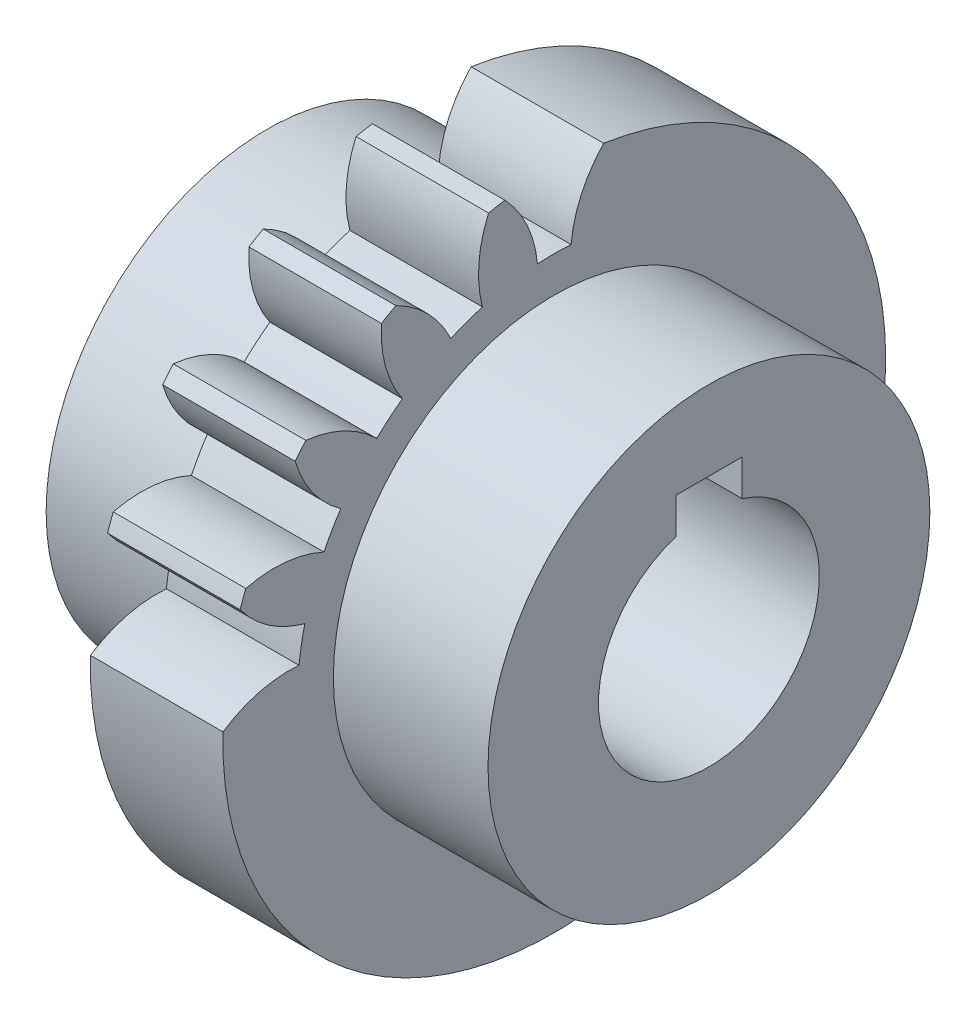
ISO-10303-21;
HEADER;
FILE_DESCRIPTION(('STEP AP214'),'2;1');
FILE_NAME('part.step','',(''),(''),'','','');
FILE_SCHEMA(('AUTOMOTIVE_DESIGN { 1 0 10303 214 1 1 1 1 }'));
ENDSEC;
DATA;
#1=APPLICATION_CONTEXT('core data for automotive mechanical design processes');
#2=APPLICATION_PROTOCOL_DEFINITION('international standard','automotive_design',2000,#1);
#3=PRODUCT_CONTEXT('',#1,'mechanical');
#4=PRODUCT('Part','Part','',(#3));
#5=PRODUCT_RELATED_PRODUCT_CATEGORY('part','',(#4));
#6=PRODUCT_DEFINITION_FORMATION('','',#4);
#7=PRODUCT_DEFINITION_CONTEXT('part definition',#1,'design');
#8=PRODUCT_DEFINITION('design','',#6,#7);
#9=PRODUCT_DEFINITION_SHAPE('','',#8);
#10=(LENGTH_UNIT() NAMED_UNIT(*) SI_UNIT(.MILLI.,.METRE.));
#11=(NAMED_UNIT(*) PLANE_ANGLE_UNIT() SI_UNIT($,.RADIAN.));
#12=(NAMED_UNIT(*) SI_UNIT($,.STERADIAN.) SOLID_ANGLE_UNIT());
#13=UNCERTAINTY_MEASURE_WITH_UNIT(LENGTH_MEASURE(1.E-05),#10,'distance_accuracy_value','');
#14=(GEOMETRIC_REPRESENTATION_CONTEXT(3) GLOBAL_UNCERTAINTY_ASSIGNED_CONTEXT((#13)) GLOBAL_UNIT_ASSIGNED_CONTEXT((#10,
#11,#12)) REPRESENTATION_CONTEXT('',''));
#15=CARTESIAN_POINT('',(0.,0.,0.));
#16=DIRECTION('',(0.,0.,1.));
#17=DIRECTION('',(1.,0.,0.));
#18=AXIS2_PLACEMENT_3D('',#15,#16,#17);
#19=CARTESIAN_POINT('',(-14.0000254,0.,0.));
#20=DIRECTION('',(-1.,0.,0.));
#21=DIRECTION('',(0.,0.,1.));
#22=AXIS2_PLACEMENT_3D('',#19,#20,#21);
#23=PLANE('',#22);
#24=CARTESIAN_POINT('',(-14.0000254,0.,0.));
#25=DIRECTION('',(-1.,0.,0.));
#26=DIRECTION('',(0.,0.,1.));
#27=AXIS2_PLACEMENT_3D('',#24,#25,#26);
#28=CIRCLE('',#27,20.);
#29=CARTESIAN_POINT('',(-14.0000254,0.,20.));
#30=VERTEX_POINT('',#29);
#31=EDGE_CURVE('E232',#30,#30,#28,.T.);
#32=ORIENTED_EDGE('',*,*,#31,.T.);
#33=EDGE_LOOP('',(#32));
#34=FACE_BOUND('',#33,.T.);
#35=CARTESIAN_POINT('',(-14.0000254,0.,0.));
#36=DIRECTION('',(-1.,0.,0.));
#37=DIRECTION('',(0.,0.,1.));
#38=AXIS2_PLACEMENT_3D('',#35,#36,#37);
#39=CIRCLE('',#38,10.);
#40=CARTESIAN_POINT('',(-14.0000254,9.53939201416946,3.));
#41=VERTEX_POINT('',#40);
#42=CARTESIAN_POINT('',(-14.0000254,9.53939201416946,-3.));
#43=VERTEX_POINT('',#42);
#44=EDGE_CURVE('E226',#41,#43,#39,.F.);
#45=ORIENTED_EDGE('',*,*,#44,.T.);
#46=DIRECTION('',(0.,1.,0.));
#47=VECTOR('',#46,1.);
#48=CARTESIAN_POINT('',(-14.0000254,0.,-3.));
#49=LINE('',#48,#47);
#50=CARTESIAN_POINT('',(-14.0000254,12.8,-3.));
#51=VERTEX_POINT('',#50);
#52=EDGE_CURVE('E221',#43,#51,#49,.T.);
#53=ORIENTED_EDGE('',*,*,#52,.T.);
#54=DIRECTION('',(0.,0.,1.));
#55=VECTOR('',#54,1.);
#56=CARTESIAN_POINT('',(-14.0000254,12.8,0.));
#57=LINE('',#56,#55);
#58=CARTESIAN_POINT('',(-14.0000254,12.8,3.));
#59=VERTEX_POINT('',#58);
#60=EDGE_CURVE('E224',#51,#59,#57,.T.);
#61=ORIENTED_EDGE('',*,*,#60,.T.);
#62=DIRECTION('',(0.,-1.,0.));
#63=VECTOR('',#62,1.);
#64=CARTESIAN_POINT('',(-14.0000254,0.,3.));
#65=LINE('',#64,#63);
#66=EDGE_CURVE('E209',#59,#41,#65,.T.);
#67=ORIENTED_EDGE('',*,*,#66,.T.);
#68=EDGE_LOOP('',(#45,#53,#61,#67));
#69=FACE_BOUND('',#68,.T.);
#70=ADVANCED_FACE('F37',(#34,#69),#23,.T.);
#71=CARTESIAN_POINT('',(26.0000254,0.,0.));
#72=DIRECTION('',(1.,0.,0.));
#73=DIRECTION('',(0.,0.,-1.));
#74=AXIS2_PLACEMENT_3D('',#71,#72,#73);
#75=PLANE('',#74);
#76=CARTESIAN_POINT('',(26.0000254,0.,0.));
#77=DIRECTION('',(1.,0.,0.));
#78=DIRECTION('',(0.,0.,-1.));
#79=AXIS2_PLACEMENT_3D('',#76,#77,#78);
#80=CIRCLE('',#79,20.);
#81=CARTESIAN_POINT('',(26.0000254,0.,-20.));
#82=VERTEX_POINT('',#81);
#83=EDGE_CURVE('E229',#82,#82,#80,.T.);
#84=ORIENTED_EDGE('',*,*,#83,.T.);
#85=EDGE_LOOP('',(#84));
#86=FACE_BOUND('',#85,.T.);
#87=DIRECTION('',(0.,0.,-1.));
#88=VECTOR('',#87,1.);
#89=CARTESIAN_POINT('',(26.0000254,12.8,0.));
#90=LINE('',#89,#88);
#91=CARTESIAN_POINT('',(26.0000254,12.8,3.));
#92=VERTEX_POINT('',#91);
#93=CARTESIAN_POINT('',(26.0000254,12.8,-3.));
#94=VERTEX_POINT('',#93);
#95=EDGE_CURVE('E11',#92,#94,#90,.T.);
#96=ORIENTED_EDGE('',*,*,#95,.T.);
#97=DIRECTION('',(0.,-1.,0.));
#98=VECTOR('',#97,1.);
#99=CARTESIAN_POINT('',(26.0000254,0.,-3.));
#100=LINE('',#99,#98);
#101=CARTESIAN_POINT('',(26.0000254,9.53939201416946,-3.));
#102=VERTEX_POINT('',#101);
#103=EDGE_CURVE('E216',#94,#102,#100,.T.);
#104=ORIENTED_EDGE('',*,*,#103,.T.);
#105=CARTESIAN_POINT('',(26.0000254,0.,0.));
#106=DIRECTION('',(1.,0.,0.));
#107=DIRECTION('',(0.,0.,-1.));
#108=AXIS2_PLACEMENT_3D('',#105,#106,#107);
#109=CIRCLE('',#108,10.);
#110=CARTESIAN_POINT('',(26.0000254,9.53939201416946,3.));
#111=VERTEX_POINT('',#110);
#112=EDGE_CURVE('E214',#102,#111,#109,.F.);
#113=ORIENTED_EDGE('',*,*,#112,.T.);
#114=DIRECTION('',(0.,1.,0.));
#115=VECTOR('',#114,1.);
#116=CARTESIAN_POINT('',(26.0000254,0.,3.));
#117=LINE('',#116,#115);
#118=EDGE_CURVE('E52',#111,#92,#117,.T.);
#119=ORIENTED_EDGE('',*,*,#118,.T.);
#120=EDGE_LOOP('',(#96,#104,#113,#119));
#121=FACE_BOUND('',#120,.T.);
#122=ADVANCED_FACE('F212',(#86,#121),#75,.T.);
#123=CARTESIAN_POINT('',(40.0000508,0.,0.));
#124=DIRECTION('',(-1.,0.,0.));
#125=DIRECTION('',(0.,0.,1.));
#126=AXIS2_PLACEMENT_3D('',#123,#124,#125);
#127=CYLINDRICAL_SURFACE('',#126,10.);
#128=ORIENTED_EDGE('',*,*,#112,.F.);
#129=DIRECTION('',(-1.,0.,0.));
#130=VECTOR('',#129,1.);
#131=CARTESIAN_POINT('',(40.0000508,9.53939201416946,-3.));
#132=LINE('',#131,#130);
#133=EDGE_CURVE('E45',#102,#43,#132,.T.);
#134=ORIENTED_EDGE('',*,*,#133,.T.);
#135=ORIENTED_EDGE('',*,*,#44,.F.);
#136=DIRECTION('',(-1.,0.,0.));
#137=VECTOR('',#136,1.);
#138=CARTESIAN_POINT('',(40.0000508,9.53939201416946,3.));
#139=LINE('',#138,#137);
#140=EDGE_CURVE('E369',#41,#111,#139,.F.);
#141=ORIENTED_EDGE('',*,*,#140,.T.);
#142=EDGE_LOOP('',(#128,#134,#135,#141));
#143=FACE_BOUND('',#142,.T.);
#144=ADVANCED_FACE('F374',(#143),#127,.F.);
#145=CARTESIAN_POINT('',(12.,0.,0.));
#146=DIRECTION('',(-1.,0.,0.));
#147=DIRECTION('',(0.,0.,1.));
#148=AXIS2_PLACEMENT_3D('',#145,#146,#147);
#149=PLANE('',#148);
#150=CARTESIAN_POINT('',(12.,0.,0.));
#151=DIRECTION('',(-1.,0.,0.));
#152=DIRECTION('',(0.,0.,1.));
#153=AXIS2_PLACEMENT_3D('',#150,#151,#152);
#154=CIRCLE('',#153,20.);
#155=CARTESIAN_POINT('',(12.,0.,20.));
#156=VERTEX_POINT('',#155);
#157=EDGE_CURVE('E366',#156,#156,#154,.F.);
#158=ORIENTED_EDGE('',*,*,#157,.F.);
#159=EDGE_LOOP('',(#158));
#160=FACE_BOUND('',#159,.T.);
#161=CARTESIAN_POINT('',(12.,15.9448796993342,19.7353492768388));
#162=DIRECTION('',(-1.,0.,0.));
#163=DIRECTION('',(0.,0.984807753012209,-0.173648177666927));
#164=AXIS2_PLACEMENT_3D('',#161,#162,#163);
#165=CIRCLE('',#164,10.8000000000108);
#166=CARTESIAN_POINT('',(12.,5.5269259665438,22.5824952200023));
#167=VERTEX_POINT('',#166);
#168=CARTESIAN_POINT('',(12.,9.55077176545093,28.4391061513203));
#169=VERTEX_POINT('',#168);
#170=EDGE_CURVE('E254',#167,#169,#165,.T.);
#171=ORIENTED_EDGE('',*,*,#170,.F.);
#172=CARTESIAN_POINT('',(12.,0.,0.));
#173=DIRECTION('',(-1.,0.,0.));
#174=DIRECTION('',(0.,0.984807753012209,-0.173648177666927));
#175=AXIS2_PLACEMENT_3D('',#172,#173,#174);
#176=CIRCLE('',#175,23.2490000000233);
#177=CARTESIAN_POINT('',(12.,2.53005670540503,23.1109241283969));
#178=VERTEX_POINT('',#177);
#179=EDGE_CURVE('E259',#178,#167,#176,.T.);
#180=ORIENTED_EDGE('',*,*,#179,.F.);
#181=CARTESIAN_POINT('',(12.,-8.23339880453698,23.9986321241547));
#182=DIRECTION('',(-1.,0.,0.));
#183=DIRECTION('',(0.,0.984807753012209,-0.173648177666927));
#184=AXIS2_PLACEMENT_3D('',#181,#182,#183);
#185=CIRCLE('',#184,10.8000000000108);
#186=CARTESIAN_POINT('',(12.,0.751957411123652,29.9905745202331));
#187=VERTEX_POINT('',#186);
#188=EDGE_CURVE('E256',#187,#178,#185,.T.);
#189=ORIENTED_EDGE('',*,*,#188,.F.);
#190=CARTESIAN_POINT('',(12.,0.,0.));
#191=DIRECTION('',(-1.,0.,0.));
#192=DIRECTION('',(0.,0.,1.));
#193=AXIS2_PLACEMENT_3D('',#190,#191,#192);
#194=CIRCLE('',#193,30.00000000003);
#195=CARTESIAN_POINT('',(12.,29.6655263389407,-4.4672751242131));
#196=VERTEX_POINT('',#195);
#197=EDGE_CURVE('E346',#196,#187,#194,.T.);
#198=ORIENTED_EDGE('',*,*,#197,.F.);
#199=CARTESIAN_POINT('',(12.,22.2043242791425,-12.2756337112079));
#200=DIRECTION('',(-1.,0.,0.));
#201=DIRECTION('',(0.,0.,-1.));
#202=AXIS2_PLACEMENT_3D('',#199,#200,#201);
#203=CIRCLE('',#202,10.8000000000108);
#204=CARTESIAN_POINT('',(12.,23.1991569972097,-1.52155040005134));
#205=VERTEX_POINT('',#204);
#206=EDGE_CURVE('E318',#205,#196,#203,.T.);
#207=ORIENTED_EDGE('',*,*,#206,.F.);
#208=CARTESIAN_POINT('',(12.,0.,0.));
#209=DIRECTION('',(-1.,0.,0.));
#210=DIRECTION('',(0.,0.,-1.));
#211=AXIS2_PLACEMENT_3D('',#208,#209,#210);
#212=CIRCLE('',#211,23.2490000000233);
#213=CARTESIAN_POINT('',(12.,23.1991569972097,1.52155040005133));
#214=VERTEX_POINT('',#213);
#215=EDGE_CURVE('E323',#214,#205,#212,.T.);
#216=ORIENTED_EDGE('',*,*,#215,.F.);
#217=CARTESIAN_POINT('',(12.,22.2043242791425,12.2756337112079));
#218=DIRECTION('',(-1.,0.,0.));
#219=DIRECTION('',(0.,0.,-1.));
#220=AXIS2_PLACEMENT_3D('',#217,#218,#219);
#221=CIRCLE('',#220,10.8000000000108);
#222=CARTESIAN_POINT('',(12.,29.6655263389407,4.4672751242131));
#223=VERTEX_POINT('',#222);
#224=EDGE_CURVE('E320',#223,#214,#221,.T.);
#225=ORIENTED_EDGE('',*,*,#224,.F.);
#226=CARTESIAN_POINT('',(12.,29.4043742706912,5.94834210103243));
#227=VERTEX_POINT('',#226);
#228=EDGE_CURVE('E343',#227,#223,#194,.T.);
#229=ORIENTED_EDGE('',*,*,#228,.F.);
#230=CARTESIAN_POINT('',(12.,25.0637536759683,-3.94099624149085));
#231=DIRECTION('',(-1.,0.,0.));
#232=DIRECTION('',(0.,0.342020143325669,-0.939692620785908));
#233=AXIS2_PLACEMENT_3D('',#230,#231,#232);
#234=CIRCLE('',#233,10.8000000000108);
#235=CARTESIAN_POINT('',(12.,22.3204775246345,6.50478931813829));
#236=VERTEX_POINT('',#235);
#237=EDGE_CURVE('E296',#236,#227,#234,.T.);
#238=ORIENTED_EDGE('',*,*,#237,.F.);
#239=CARTESIAN_POINT('',(12.,0.,0.));
#240=DIRECTION('',(-1.,0.,0.));
#241=DIRECTION('',(0.,0.342020143325669,-0.939692620785908));
#242=AXIS2_PLACEMENT_3D('',#239,#240,#241);
#243=CIRCLE('',#242,23.2490000000233);
#244=CARTESIAN_POINT('',(12.,21.279675752829,9.36436868430246));
#245=VERTEX_POINT('',#244);
#246=EDGE_CURVE('E301',#245,#236,#243,.T.);
#247=ORIENTED_EDGE('',*,*,#246,.F.);
#248=CARTESIAN_POINT('',(12.,16.6667256733268,19.1296485862948));
#249=DIRECTION('',(-1.,0.,0.));
#250=DIRECTION('',(0.,0.342020143325669,-0.939692620785908));
#251=AXIS2_PLACEMENT_3D('',#248,#249,#250);
#252=CIRCLE('',#251,10.8000000000108);
#253=CARTESIAN_POINT('',(12.,26.348578114174,14.3440730395194));
#254=VERTEX_POINT('',#253);
#255=EDGE_CURVE('E298',#254,#245,#252,.T.);
#256=ORIENTED_EDGE('',*,*,#255,.F.);
#257=CARTESIAN_POINT('',(12.,25.5966207030503,15.6465014807137));
#258=VERTEX_POINT('',#257);
#259=EDGE_CURVE('E351',#258,#254,#194,.T.);
#260=ORIENTED_EDGE('',*,*,#259,.F.);
#261=CARTESIAN_POINT('',(12.,24.9001244778637,4.86898353786001));
#262=DIRECTION('',(-1.,0.,0.));
#263=DIRECTION('',(0.,0.642787609686541,-0.766044443118977));
#264=AXIS2_PLACEMENT_3D('',#261,#262,#263);
#265=CIRCLE('',#264,10.8000000000108);
#266=CARTESIAN_POINT('',(12.,18.7496190474238,13.7465554440944));
#267=VERTEX_POINT('',#266);
#268=EDGE_CURVE('E267',#267,#258,#265,.T.);
#269=ORIENTED_EDGE('',*,*,#268,.F.);
#270=CARTESIAN_POINT('',(12.,0.,0.));
#271=DIRECTION('',(-1.,0.,0.));
#272=DIRECTION('',(0.,0.642787609686541,-0.766044443118977));
#273=AXIS2_PLACEMENT_3D('',#270,#271,#272);
#274=CIRCLE('',#273,23.2490000000233);
#275=CARTESIAN_POINT('',(12.,16.7935515580906,16.077705901864));
#276=VERTEX_POINT('',#275);
#277=EDGE_CURVE('E272',#276,#267,#274,.T.);
#278=ORIENTED_EDGE('',*,*,#277,.F.);
#279=CARTESIAN_POINT('',(12.,9.11887397663404,23.6763455183296));
#280=DIRECTION('',(-1.,0.,0.));
#281=DIRECTION('',(0.,0.642787609686541,-0.766044443118977));
#282=AXIS2_PLACEMENT_3D('',#279,#280,#281);
#283=CIRCLE('',#282,10.8000000000108);
#284=CARTESIAN_POINT('',(12.,19.8536025052401,22.4907640502879));
#285=VERTEX_POINT('',#284);
#286=EDGE_CURVE('E269',#285,#276,#283,.T.);
#287=ORIENTED_EDGE('',*,*,#286,.F.);
#288=CARTESIAN_POINT('',(12.,18.7015369127332,23.4574618640525));
#289=VERTEX_POINT('',#288);
#290=EDGE_CURVE('E492',#289,#285,#194,.T.);
#291=ORIENTED_EDGE('',*,*,#290,.F.);
#292=CARTESIAN_POINT('',(12.,21.7331727810299,13.0916920440011));
#293=DIRECTION('',(-1.,0.,0.));
#294=DIRECTION('',(0.,0.86602540378444,-0.499999999999998));
#295=AXIS2_PLACEMENT_3D('',#292,#293,#294);
#296=CIRCLE('',#295,10.8000000000108);
#297=CARTESIAN_POINT('',(12.,12.9172797981876,19.3302841059415));
#298=VERTEX_POINT('',#297);
#299=EDGE_CURVE('E235',#298,#289,#296,.T.);
#300=ORIENTED_EDGE('',*,*,#299,.F.);
#301=CARTESIAN_POINT('',(12.,0.,0.));
#302=DIRECTION('',(-1.,0.,0.));
#303=DIRECTION('',(0.,0.86602540378444,-0.499999999999998));
#304=AXIS2_PLACEMENT_3D('',#301,#302,#303);
#305=CIRCLE('',#304,23.2490000000233);
#306=CARTESIAN_POINT('',(12.,10.281877199022,20.8518345059928));
#307=VERTEX_POINT('',#306);
#308=EDGE_CURVE('E240',#307,#298,#305,.T.);
#309=ORIENTED_EDGE('',*,*,#308,.F.);
#310=CARTESIAN_POINT('',(12.,0.471151498112487,25.3673257552089));
#311=DIRECTION('',(-1.,0.,0.));
#312=DIRECTION('',(0.,0.86602540378444,-0.499999999999998));
#313=AXIS2_PLACEMENT_3D('',#310,#311,#312);
#314=CIRCLE('',#313,10.8000000000108);
#315=CARTESIAN_POINT('',(12.,10.9639894262075,27.9247369882656));
#316=VERTEX_POINT('',#315);
#317=EDGE_CURVE('E237',#316,#307,#314,.T.);
#318=ORIENTED_EDGE('',*,*,#317,.F.);
#319=EDGE_CURVE('E350',#169,#316,#194,.T.);
#320=ORIENTED_EDGE('',*,*,#319,.F.);
#321=EDGE_LOOP('',(#171,#180,#189,#198,#207,#216,#225,#229,#238,#247,#256,#260,#269,#278,#287,
#291,#300,#309,#318,#320));
#322=FACE_BOUND('',#321,.T.);
#323=ADVANCED_FACE('F39',(#160,#322),#149,.F.);
#324=CARTESIAN_POINT('',(-10.,0.,0.));
#325=DIRECTION('',(-1.,0.,0.));
#326=DIRECTION('',(0.,0.,1.));
#327=AXIS2_PLACEMENT_3D('',#324,#325,#326);
#328=CYLINDRICAL_SURFACE('',#327,30.00000000003);
#329=DIRECTION('',(-1.,0.,0.));
#330=VECTOR('',#329,1.);
#331=CARTESIAN_POINT('',(6.,9.55077176545094,28.4391061513203));
#332=LINE('',#331,#330);
#333=CARTESIAN_POINT('',(0.,9.55077176545094,28.4391061513203));
#334=VERTEX_POINT('',#333);
#335=EDGE_CURVE('E293',#169,#334,#332,.T.);
#336=ORIENTED_EDGE('',*,*,#335,.F.);
#337=ORIENTED_EDGE('',*,*,#319,.T.);
#338=DIRECTION('',(-1.,0.,0.));
#339=VECTOR('',#338,1.);
#340=CARTESIAN_POINT('',(6.,10.9639894262075,27.9247369882656));
#341=LINE('',#340,#339);
#342=CARTESIAN_POINT('',(0.,10.9639894262075,27.9247369882656));
#343=VERTEX_POINT('',#342);
#344=EDGE_CURVE('E287',#343,#316,#341,.F.);
#345=ORIENTED_EDGE('',*,*,#344,.F.);
#346=CARTESIAN_POINT('',(0.,0.,0.));
#347=DIRECTION('',(-1.,0.,0.));
#348=DIRECTION('',(0.,0.,1.));
#349=AXIS2_PLACEMENT_3D('',#346,#347,#348);
#350=CIRCLE('',#349,30.00000000003);
#351=EDGE_CURVE('E344',#334,#343,#350,.T.);
#352=ORIENTED_EDGE('',*,*,#351,.F.);
#353=EDGE_LOOP('',(#336,#337,#345,#352));
#354=FACE_BOUND('',#353,.T.);
#355=ADVANCED_FACE('F468',(#354),#328,.T.);
#356=DIRECTION('',(-1.,0.,0.));
#357=VECTOR('',#356,1.);
#358=CARTESIAN_POINT('',(6.,0.75195741112365,29.9905745202331));
#359=LINE('',#358,#357);
#360=CARTESIAN_POINT('',(0.,0.75195741112365,29.9905745202331));
#361=VERTEX_POINT('',#360);
#362=EDGE_CURVE('E291',#361,#187,#359,.F.);
#363=ORIENTED_EDGE('',*,*,#362,.F.);
#364=CARTESIAN_POINT('',(0.,29.6655263389407,-4.46727512421311));
#365=VERTEX_POINT('',#364);
#366=EDGE_CURVE('E340',#365,#361,#350,.T.);
#367=ORIENTED_EDGE('',*,*,#366,.F.);
#368=DIRECTION('',(-1.,0.,0.));
#369=VECTOR('',#368,1.);
#370=CARTESIAN_POINT('',(6.,29.6655263389407,-4.46727512421311));
#371=LINE('',#370,#369);
#372=EDGE_CURVE('E337',#196,#365,#371,.T.);
#373=ORIENTED_EDGE('',*,*,#372,.F.);
#374=ORIENTED_EDGE('',*,*,#197,.T.);
#375=EDGE_LOOP('',(#363,#367,#373,#374));
#376=FACE_BOUND('',#375,.T.);
#377=ADVANCED_FACE('F473',(#376),#328,.T.);
#378=DIRECTION('',(-1.,0.,0.));
#379=VECTOR('',#378,1.);
#380=CARTESIAN_POINT('',(6.,18.7015369127332,23.4574618640525));
#381=LINE('',#380,#379);
#382=CARTESIAN_POINT('',(0.,18.7015369127332,23.4574618640525));
#383=VERTEX_POINT('',#382);
#384=EDGE_CURVE('E289',#289,#383,#381,.T.);
#385=ORIENTED_EDGE('',*,*,#384,.F.);
#386=ORIENTED_EDGE('',*,*,#290,.T.);
#387=DIRECTION('',(-1.,0.,0.));
#388=VECTOR('',#387,1.);
#389=CARTESIAN_POINT('',(6.,19.8536025052401,22.4907640502879));
#390=LINE('',#389,#388);
#391=CARTESIAN_POINT('',(0.,19.8536025052401,22.4907640502879));
#392=VERTEX_POINT('',#391);
#393=EDGE_CURVE('E283',#392,#285,#390,.F.);
#394=ORIENTED_EDGE('',*,*,#393,.F.);
#395=EDGE_CURVE('E511',#383,#392,#350,.T.);
#396=ORIENTED_EDGE('',*,*,#395,.F.);
#397=EDGE_LOOP('',(#385,#386,#394,#396));
#398=FACE_BOUND('',#397,.T.);
#399=ADVANCED_FACE('F476',(#398),#328,.T.);
#400=DIRECTION('',(-1.,0.,0.));
#401=VECTOR('',#400,1.);
#402=CARTESIAN_POINT('',(6.,25.5966207030503,15.6465014807137));
#403=LINE('',#402,#401);
#404=CARTESIAN_POINT('',(0.,25.5966207030503,15.6465014807137));
#405=VERTEX_POINT('',#404);
#406=EDGE_CURVE('E285',#258,#405,#403,.T.);
#407=ORIENTED_EDGE('',*,*,#406,.F.);
#408=ORIENTED_EDGE('',*,*,#259,.T.);
#409=DIRECTION('',(-1.,0.,0.));
#410=VECTOR('',#409,1.);
#411=CARTESIAN_POINT('',(6.,26.348578114174,14.3440730395194));
#412=LINE('',#411,#410);
#413=CARTESIAN_POINT('',(0.,26.348578114174,14.3440730395194));
#414=VERTEX_POINT('',#413);
#415=EDGE_CURVE('E312',#414,#254,#412,.F.);
#416=ORIENTED_EDGE('',*,*,#415,.F.);
#417=EDGE_CURVE('E345',#405,#414,#350,.T.);
#418=ORIENTED_EDGE('',*,*,#417,.F.);
#419=EDGE_LOOP('',(#407,#408,#416,#418));
#420=FACE_BOUND('',#419,.T.);
#421=ADVANCED_FACE('F464',(#420),#328,.T.);
#422=CARTESIAN_POINT('',(0.,0.,0.));
#423=DIRECTION('',(1.,0.,0.));
#424=DIRECTION('',(0.,0.,-1.));
#425=AXIS2_PLACEMENT_3D('',#422,#423,#424);
#426=PLANE('',#425);
#427=CARTESIAN_POINT('',(0.,0.,0.));
#428=DIRECTION('',(1.,0.,0.));
#429=DIRECTION('',(0.,0.,-1.));
#430=AXIS2_PLACEMENT_3D('',#427,#428,#429);
#431=CIRCLE('',#430,20.);
#432=CARTESIAN_POINT('',(0.,0.,-20.));
#433=VERTEX_POINT('',#432);
#434=EDGE_CURVE('E363',#433,#433,#431,.F.);
#435=ORIENTED_EDGE('',*,*,#434,.F.);
#436=EDGE_LOOP('',(#435));
#437=FACE_BOUND('',#436,.T.);
#438=CARTESIAN_POINT('',(0.,15.9448796993342,19.7353492768388));
#439=DIRECTION('',(-1.,0.,0.));
#440=DIRECTION('',(0.,0.984807753012209,-0.173648177666927));
#441=AXIS2_PLACEMENT_3D('',#438,#439,#440);
#442=CIRCLE('',#441,10.8000000000108);
#443=CARTESIAN_POINT('',(0.,5.5269259665438,22.5824952200023));
#444=VERTEX_POINT('',#443);
#445=EDGE_CURVE('E60',#444,#334,#442,.T.);
#446=ORIENTED_EDGE('',*,*,#445,.T.);
#447=ORIENTED_EDGE('',*,*,#351,.T.);
#448=CARTESIAN_POINT('',(0.,0.471151498112487,25.3673257552089));
#449=DIRECTION('',(1.,0.,0.));
#450=DIRECTION('',(0.,0.,-1.));
#451=AXIS2_PLACEMENT_3D('',#448,#449,#450);
#452=CIRCLE('',#451,10.8000000000108);
#453=CARTESIAN_POINT('',(0.,10.281877199022,20.8518345059928));
#454=VERTEX_POINT('',#453);
#455=EDGE_CURVE('E359',#454,#343,#452,.T.);
#456=ORIENTED_EDGE('',*,*,#455,.F.);
#457=CARTESIAN_POINT('',(0.,0.,0.));
#458=DIRECTION('',(-1.,0.,0.));
#459=DIRECTION('',(0.,0.86602540378444,-0.499999999999998));
#460=AXIS2_PLACEMENT_3D('',#457,#458,#459);
#461=CIRCLE('',#460,23.2490000000233);
#462=CARTESIAN_POINT('',(0.,12.9172797981876,19.3302841059415));
#463=VERTEX_POINT('',#462);
#464=EDGE_CURVE('E238',#454,#463,#461,.T.);
#465=ORIENTED_EDGE('',*,*,#464,.T.);
#466=CARTESIAN_POINT('',(0.,21.7331727810299,13.0916920440011));
#467=DIRECTION('',(-1.,0.,0.));
#468=DIRECTION('',(0.,0.86602540378444,-0.499999999999998));
#469=AXIS2_PLACEMENT_3D('',#466,#467,#468);
#470=CIRCLE('',#469,10.8000000000108);
#471=EDGE_CURVE('E243',#463,#383,#470,.T.);
#472=ORIENTED_EDGE('',*,*,#471,.T.);
#473=ORIENTED_EDGE('',*,*,#395,.T.);
#474=CARTESIAN_POINT('',(0.,9.11887397663404,23.6763455183296));
#475=DIRECTION('',(1.,0.,0.));
#476=DIRECTION('',(0.,0.,-1.));
#477=AXIS2_PLACEMENT_3D('',#474,#475,#476);
#478=CIRCLE('',#477,10.8000000000108);
#479=CARTESIAN_POINT('',(0.,16.7935515580906,16.077705901864));
#480=VERTEX_POINT('',#479);
#481=EDGE_CURVE('E357',#480,#392,#478,.T.);
#482=ORIENTED_EDGE('',*,*,#481,.F.);
#483=CARTESIAN_POINT('',(0.,0.,0.));
#484=DIRECTION('',(-1.,0.,0.));
#485=DIRECTION('',(0.,0.642787609686541,-0.766044443118977));
#486=AXIS2_PLACEMENT_3D('',#483,#484,#485);
#487=CIRCLE('',#486,23.2490000000233);
#488=CARTESIAN_POINT('',(0.,18.7496190474238,13.7465554440944));
#489=VERTEX_POINT('',#488);
#490=EDGE_CURVE('E270',#480,#489,#487,.T.);
#491=ORIENTED_EDGE('',*,*,#490,.T.);
#492=CARTESIAN_POINT('',(0.,24.9001244778637,4.86898353786001));
#493=DIRECTION('',(-1.,0.,0.));
#494=DIRECTION('',(0.,0.642787609686541,-0.766044443118977));
#495=AXIS2_PLACEMENT_3D('',#492,#493,#494);
#496=CIRCLE('',#495,10.8000000000108);
#497=EDGE_CURVE('E253',#489,#405,#496,.T.);
#498=ORIENTED_EDGE('',*,*,#497,.T.);
#499=ORIENTED_EDGE('',*,*,#417,.T.);
#500=CARTESIAN_POINT('',(0.,16.6667256733268,19.1296485862948));
#501=DIRECTION('',(1.,0.,0.));
#502=DIRECTION('',(0.,0.,-1.));
#503=AXIS2_PLACEMENT_3D('',#500,#501,#502);
#504=CIRCLE('',#503,10.8000000000108);
#505=CARTESIAN_POINT('',(0.,21.279675752829,9.36436868430246));
#506=VERTEX_POINT('',#505);
#507=EDGE_CURVE('E354',#506,#414,#504,.T.);
#508=ORIENTED_EDGE('',*,*,#507,.F.);
#509=CARTESIAN_POINT('',(0.,0.,0.));
#510=DIRECTION('',(-1.,0.,0.));
#511=DIRECTION('',(0.,0.342020143325669,-0.939692620785908));
#512=AXIS2_PLACEMENT_3D('',#509,#510,#511);
#513=CIRCLE('',#512,23.2490000000233);
#514=CARTESIAN_POINT('',(0.,22.3204775246345,6.50478931813829));
#515=VERTEX_POINT('',#514);
#516=EDGE_CURVE('E299',#506,#515,#513,.T.);
#517=ORIENTED_EDGE('',*,*,#516,.T.);
#518=CARTESIAN_POINT('',(0.,25.0637536759683,-3.94099624149085));
#519=DIRECTION('',(-1.,0.,0.));
#520=DIRECTION('',(0.,0.342020143325669,-0.939692620785908));
#521=AXIS2_PLACEMENT_3D('',#518,#519,#520);
#522=CIRCLE('',#521,10.8000000000108);
#523=CARTESIAN_POINT('',(0.,29.4043742706912,5.94834210103243));
#524=VERTEX_POINT('',#523);
#525=EDGE_CURVE('E295',#515,#524,#522,.T.);
#526=ORIENTED_EDGE('',*,*,#525,.T.);
#527=CARTESIAN_POINT('',(0.,29.6655263389407,4.46727512421311));
#528=VERTEX_POINT('',#527);
#529=EDGE_CURVE('E339',#524,#528,#350,.T.);
#530=ORIENTED_EDGE('',*,*,#529,.T.);
#531=CARTESIAN_POINT('',(0.,22.2043242791425,12.2756337112079));
#532=DIRECTION('',(1.,0.,0.));
#533=DIRECTION('',(0.,0.,-1.));
#534=AXIS2_PLACEMENT_3D('',#531,#532,#533);
#535=CIRCLE('',#534,10.8000000000108);
#536=CARTESIAN_POINT('',(0.,23.1991569972097,1.52155040005133));
#537=VERTEX_POINT('',#536);
#538=EDGE_CURVE('E349',#537,#528,#535,.T.);
#539=ORIENTED_EDGE('',*,*,#538,.F.);
#540=CARTESIAN_POINT('',(0.,0.,0.));
#541=DIRECTION('',(-1.,0.,0.));
#542=DIRECTION('',(0.,0.,-1.));
#543=AXIS2_PLACEMENT_3D('',#540,#541,#542);
#544=CIRCLE('',#543,23.2490000000233);
#545=CARTESIAN_POINT('',(0.,23.1991569972097,-1.52155040005134));
#546=VERTEX_POINT('',#545);
#547=EDGE_CURVE('E321',#537,#546,#544,.T.);
#548=ORIENTED_EDGE('',*,*,#547,.T.);
#549=CARTESIAN_POINT('',(0.,22.2043242791425,-12.2756337112079));
#550=DIRECTION('',(-1.,0.,0.));
#551=DIRECTION('',(0.,0.,-1.));
#552=AXIS2_PLACEMENT_3D('',#549,#550,#551);
#553=CIRCLE('',#552,10.8000000000108);
#554=EDGE_CURVE('E317',#546,#365,#553,.T.);
#555=ORIENTED_EDGE('',*,*,#554,.T.);
#556=ORIENTED_EDGE('',*,*,#366,.T.);
#557=CARTESIAN_POINT('',(0.,-8.23339880453698,23.9986321241547));
#558=DIRECTION('',(1.,0.,0.));
#559=DIRECTION('',(0.,0.,-1.));
#560=AXIS2_PLACEMENT_3D('',#557,#558,#559);
#561=CIRCLE('',#560,10.8000000000108);
#562=CARTESIAN_POINT('',(0.,2.53005670540503,23.1109241283969));
#563=VERTEX_POINT('',#562);
#564=EDGE_CURVE('E361',#563,#361,#561,.T.);
#565=ORIENTED_EDGE('',*,*,#564,.F.);
#566=CARTESIAN_POINT('',(0.,0.,0.));
#567=DIRECTION('',(-1.,0.,0.));
#568=DIRECTION('',(0.,0.984807753012209,-0.173648177666927));
#569=AXIS2_PLACEMENT_3D('',#566,#567,#568);
#570=CIRCLE('',#569,23.2490000000233);
#571=EDGE_CURVE('E257',#563,#444,#570,.T.);
#572=ORIENTED_EDGE('',*,*,#571,.T.);
#573=EDGE_LOOP('',(#446,#447,#456,#465,#472,#473,#482,#491,#498,#499,#508,#517,#526,#530,#539,
#548,#555,#556,#565,#572));
#574=FACE_BOUND('',#573,.T.);
#575=ADVANCED_FACE('F462',(#437,#574),#426,.F.);
#576=DIRECTION('',(-1.,0.,0.));
#577=VECTOR('',#576,1.);
#578=CARTESIAN_POINT('',(6.,29.4043742706912,5.94834210103243));
#579=LINE('',#578,#577);
#580=EDGE_CURVE('E315',#227,#524,#579,.T.);
#581=ORIENTED_EDGE('',*,*,#580,.F.);
#582=ORIENTED_EDGE('',*,*,#228,.T.);
#583=DIRECTION('',(-1.,0.,0.));
#584=VECTOR('',#583,1.);
#585=CARTESIAN_POINT('',(6.,29.6655263389407,4.46727512421311));
#586=LINE('',#585,#584);
#587=EDGE_CURVE('E334',#528,#223,#586,.F.);
#588=ORIENTED_EDGE('',*,*,#587,.F.);
#589=ORIENTED_EDGE('',*,*,#529,.F.);
#590=EDGE_LOOP('',(#581,#582,#588,#589));
#591=FACE_BOUND('',#590,.T.);
#592=ADVANCED_FACE('F460',(#591),#328,.T.);
#593=CARTESIAN_POINT('',(12.,22.2043242791425,-12.2756337112079));
#594=DIRECTION('',(-1.,0.,0.));
#595=DIRECTION('',(0.,0.,1.));
#596=AXIS2_PLACEMENT_3D('',#593,#594,#595);
#597=CYLINDRICAL_SURFACE('',#596,10.8000000000108);
#598=ORIENTED_EDGE('',*,*,#372,.T.);
#599=ORIENTED_EDGE('',*,*,#554,.F.);
#600=DIRECTION('',(-1.,0.,0.));
#601=VECTOR('',#600,1.);
#602=CARTESIAN_POINT('',(12.,23.1991569972097,-1.52155040005134));
#603=LINE('',#602,#601);
#604=EDGE_CURVE('E325',#205,#546,#603,.T.);
#605=ORIENTED_EDGE('',*,*,#604,.F.);
#606=ORIENTED_EDGE('',*,*,#206,.T.);
#607=EDGE_LOOP('',(#598,#599,#605,#606));
#608=FACE_BOUND('',#607,.T.);
#609=ADVANCED_FACE('F456',(#608),#597,.T.);
#610=CARTESIAN_POINT('',(12.,22.2043242791425,12.2756337112079));
#611=DIRECTION('',(-1.,0.,0.));
#612=DIRECTION('',(0.,0.,1.));
#613=AXIS2_PLACEMENT_3D('',#610,#611,#612);
#614=CYLINDRICAL_SURFACE('',#613,10.8000000000108);
#615=ORIENTED_EDGE('',*,*,#587,.T.);
#616=ORIENTED_EDGE('',*,*,#224,.T.);
#617=DIRECTION('',(-1.,0.,0.));
#618=VECTOR('',#617,1.);
#619=CARTESIAN_POINT('',(12.,23.1991569972097,1.52155040005133));
#620=LINE('',#619,#618);
#621=EDGE_CURVE('E332',#214,#537,#620,.T.);
#622=ORIENTED_EDGE('',*,*,#621,.T.);
#623=ORIENTED_EDGE('',*,*,#538,.T.);
#624=EDGE_LOOP('',(#615,#616,#622,#623));
#625=FACE_BOUND('',#624,.T.);
#626=ADVANCED_FACE('F452',(#625),#614,.T.);
#627=CARTESIAN_POINT('',(12.,0.,0.));
#628=DIRECTION('',(-1.,0.,0.));
#629=DIRECTION('',(0.,0.,1.));
#630=AXIS2_PLACEMENT_3D('',#627,#628,#629);
#631=CYLINDRICAL_SURFACE('',#630,23.2490000000233);
#632=ORIENTED_EDGE('',*,*,#547,.F.);
#633=ORIENTED_EDGE('',*,*,#621,.F.);
#634=ORIENTED_EDGE('',*,*,#215,.T.);
#635=ORIENTED_EDGE('',*,*,#604,.T.);
#636=EDGE_LOOP('',(#632,#633,#634,#635));
#637=FACE_BOUND('',#636,.T.);
#638=ADVANCED_FACE('F448',(#637),#631,.T.);
#639=CARTESIAN_POINT('',(12.,25.0637536759683,-3.94099624149085));
#640=DIRECTION('',(-1.,0.,0.));
#641=DIRECTION('',(0.,0.,1.));
#642=AXIS2_PLACEMENT_3D('',#639,#640,#641);
#643=CYLINDRICAL_SURFACE('',#642,10.8000000000108);
#644=ORIENTED_EDGE('',*,*,#580,.T.);
#645=ORIENTED_EDGE('',*,*,#525,.F.);
#646=DIRECTION('',(-1.,0.,0.));
#647=VECTOR('',#646,1.);
#648=CARTESIAN_POINT('',(12.,22.3204775246345,6.50478931813829));
#649=LINE('',#648,#647);
#650=EDGE_CURVE('E303',#236,#515,#649,.T.);
#651=ORIENTED_EDGE('',*,*,#650,.F.);
#652=ORIENTED_EDGE('',*,*,#237,.T.);
#653=EDGE_LOOP('',(#644,#645,#651,#652));
#654=FACE_BOUND('',#653,.T.);
#655=ADVANCED_FACE('F444',(#654),#643,.T.);
#656=CARTESIAN_POINT('',(12.,16.6667256733268,19.1296485862948));
#657=DIRECTION('',(-1.,0.,0.));
#658=DIRECTION('',(0.,0.,1.));
#659=AXIS2_PLACEMENT_3D('',#656,#657,#658);
#660=CYLINDRICAL_SURFACE('',#659,10.8000000000108);
#661=ORIENTED_EDGE('',*,*,#415,.T.);
#662=ORIENTED_EDGE('',*,*,#255,.T.);
#663=DIRECTION('',(-1.,0.,0.));
#664=VECTOR('',#663,1.);
#665=CARTESIAN_POINT('',(12.,21.279675752829,9.36436868430246));
#666=LINE('',#665,#664);
#667=EDGE_CURVE('E310',#245,#506,#666,.T.);
#668=ORIENTED_EDGE('',*,*,#667,.T.);
#669=ORIENTED_EDGE('',*,*,#507,.T.);
#670=EDGE_LOOP('',(#661,#662,#668,#669));
#671=FACE_BOUND('',#670,.T.);
#672=ADVANCED_FACE('F440',(#671),#660,.T.);
#673=CARTESIAN_POINT('',(12.,0.,0.));
#674=DIRECTION('',(-1.,0.,0.));
#675=DIRECTION('',(0.,0.,1.));
#676=AXIS2_PLACEMENT_3D('',#673,#674,#675);
#677=CYLINDRICAL_SURFACE('',#676,23.2490000000233);
#678=ORIENTED_EDGE('',*,*,#516,.F.);
#679=ORIENTED_EDGE('',*,*,#667,.F.);
#680=ORIENTED_EDGE('',*,*,#246,.T.);
#681=ORIENTED_EDGE('',*,*,#650,.T.);
#682=EDGE_LOOP('',(#678,#679,#680,#681));
#683=FACE_BOUND('',#682,.T.);
#684=ADVANCED_FACE('F436',(#683),#677,.T.);
#685=CARTESIAN_POINT('',(12.,24.9001244778637,4.86898353786001));
#686=DIRECTION('',(-1.,0.,0.));
#687=DIRECTION('',(0.,0.,1.));
#688=AXIS2_PLACEMENT_3D('',#685,#686,#687);
#689=CYLINDRICAL_SURFACE('',#688,10.8000000000108);
#690=ORIENTED_EDGE('',*,*,#406,.T.);
#691=ORIENTED_EDGE('',*,*,#497,.F.);
#692=DIRECTION('',(-1.,0.,0.));
#693=VECTOR('',#692,1.);
#694=CARTESIAN_POINT('',(12.,18.7496190474238,13.7465554440944));
#695=LINE('',#694,#693);
#696=EDGE_CURVE('E274',#267,#489,#695,.T.);
#697=ORIENTED_EDGE('',*,*,#696,.F.);
#698=ORIENTED_EDGE('',*,*,#268,.T.);
#699=EDGE_LOOP('',(#690,#691,#697,#698));
#700=FACE_BOUND('',#699,.T.);
#701=ADVANCED_FACE('F432',(#700),#689,.T.);
#702=CARTESIAN_POINT('',(12.,9.11887397663404,23.6763455183296));
#703=DIRECTION('',(-1.,0.,0.));
#704=DIRECTION('',(0.,0.,1.));
#705=AXIS2_PLACEMENT_3D('',#702,#703,#704);
#706=CYLINDRICAL_SURFACE('',#705,10.8000000000108);
#707=ORIENTED_EDGE('',*,*,#393,.T.);
#708=ORIENTED_EDGE('',*,*,#286,.T.);
#709=DIRECTION('',(-1.,0.,0.));
#710=VECTOR('',#709,1.);
#711=CARTESIAN_POINT('',(12.,16.7935515580906,16.077705901864));
#712=LINE('',#711,#710);
#713=EDGE_CURVE('E281',#276,#480,#712,.T.);
#714=ORIENTED_EDGE('',*,*,#713,.T.);
#715=ORIENTED_EDGE('',*,*,#481,.T.);
#716=EDGE_LOOP('',(#707,#708,#714,#715));
#717=FACE_BOUND('',#716,.T.);
#718=ADVANCED_FACE('F428',(#717),#706,.T.);
#719=CARTESIAN_POINT('',(12.,0.,0.));
#720=DIRECTION('',(-1.,0.,0.));
#721=DIRECTION('',(0.,0.,1.));
#722=AXIS2_PLACEMENT_3D('',#719,#720,#721);
#723=CYLINDRICAL_SURFACE('',#722,23.2490000000233);
#724=ORIENTED_EDGE('',*,*,#490,.F.);
#725=ORIENTED_EDGE('',*,*,#713,.F.);
#726=ORIENTED_EDGE('',*,*,#277,.T.);
#727=ORIENTED_EDGE('',*,*,#696,.T.);
#728=EDGE_LOOP('',(#724,#725,#726,#727));
#729=FACE_BOUND('',#728,.T.);
#730=ADVANCED_FACE('F415',(#729),#723,.T.);
#731=CARTESIAN_POINT('',(12.,21.7331727810299,13.0916920440011));
#732=DIRECTION('',(-1.,0.,0.));
#733=DIRECTION('',(0.,0.,1.));
#734=AXIS2_PLACEMENT_3D('',#731,#732,#733);
#735=CYLINDRICAL_SURFACE('',#734,10.8000000000108);
#736=ORIENTED_EDGE('',*,*,#384,.T.);
#737=ORIENTED_EDGE('',*,*,#471,.F.);
#738=DIRECTION('',(-1.,0.,0.));
#739=VECTOR('',#738,1.);
#740=CARTESIAN_POINT('',(12.,12.9172797981876,19.3302841059415));
#741=LINE('',#740,#739);
#742=EDGE_CURVE('E242',#298,#463,#741,.T.);
#743=ORIENTED_EDGE('',*,*,#742,.F.);
#744=ORIENTED_EDGE('',*,*,#299,.T.);
#745=EDGE_LOOP('',(#736,#737,#743,#744));
#746=FACE_BOUND('',#745,.T.);
#747=ADVANCED_FACE('F411',(#746),#735,.T.);
#748=CARTESIAN_POINT('',(12.,0.471151498112487,25.3673257552089));
#749=DIRECTION('',(-1.,0.,0.));
#750=DIRECTION('',(0.,0.,1.));
#751=AXIS2_PLACEMENT_3D('',#748,#749,#750);
#752=CYLINDRICAL_SURFACE('',#751,10.8000000000108);
#753=ORIENTED_EDGE('',*,*,#344,.T.);
#754=ORIENTED_EDGE('',*,*,#317,.T.);
#755=DIRECTION('',(-1.,0.,0.));
#756=VECTOR('',#755,1.);
#757=CARTESIAN_POINT('',(12.,10.281877199022,20.8518345059928));
#758=LINE('',#757,#756);
#759=EDGE_CURVE('E251',#307,#454,#758,.T.);
#760=ORIENTED_EDGE('',*,*,#759,.T.);
#761=ORIENTED_EDGE('',*,*,#455,.T.);
#762=EDGE_LOOP('',(#753,#754,#760,#761));
#763=FACE_BOUND('',#762,.T.);
#764=ADVANCED_FACE('F407',(#763),#752,.T.);
#765=CARTESIAN_POINT('',(12.,0.,0.));
#766=DIRECTION('',(-1.,0.,0.));
#767=DIRECTION('',(0.,0.,1.));
#768=AXIS2_PLACEMENT_3D('',#765,#766,#767);
#769=CYLINDRICAL_SURFACE('',#768,23.2490000000233);
#770=ORIENTED_EDGE('',*,*,#464,.F.);
#771=ORIENTED_EDGE('',*,*,#759,.F.);
#772=ORIENTED_EDGE('',*,*,#308,.T.);
#773=ORIENTED_EDGE('',*,*,#742,.T.);
#774=EDGE_LOOP('',(#770,#771,#772,#773));
#775=FACE_BOUND('',#774,.T.);
#776=ADVANCED_FACE('F403',(#775),#769,.T.);
#777=CARTESIAN_POINT('',(12.,15.9448796993342,19.7353492768388));
#778=DIRECTION('',(-1.,0.,0.));
#779=DIRECTION('',(0.,0.,1.));
#780=AXIS2_PLACEMENT_3D('',#777,#778,#779);
#781=CYLINDRICAL_SURFACE('',#780,10.8000000000108);
#782=ORIENTED_EDGE('',*,*,#335,.T.);
#783=ORIENTED_EDGE('',*,*,#445,.F.);
#784=DIRECTION('',(-1.,0.,0.));
#785=VECTOR('',#784,1.);
#786=CARTESIAN_POINT('',(12.,5.5269259665438,22.5824952200023));
#787=LINE('',#786,#785);
#788=EDGE_CURVE('E261',#167,#444,#787,.T.);
#789=ORIENTED_EDGE('',*,*,#788,.F.);
#790=ORIENTED_EDGE('',*,*,#170,.T.);
#791=EDGE_LOOP('',(#782,#783,#789,#790));
#792=FACE_BOUND('',#791,.T.);
#793=ADVANCED_FACE('F406',(#792),#781,.T.);
#794=CARTESIAN_POINT('',(12.,-8.23339880453698,23.9986321241547));
#795=DIRECTION('',(-1.,0.,0.));
#796=DIRECTION('',(0.,0.,1.));
#797=AXIS2_PLACEMENT_3D('',#794,#795,#796);
#798=CYLINDRICAL_SURFACE('',#797,10.8000000000108);
#799=ORIENTED_EDGE('',*,*,#362,.T.);
#800=ORIENTED_EDGE('',*,*,#188,.T.);
#801=DIRECTION('',(-1.,0.,0.));
#802=VECTOR('',#801,1.);
#803=CARTESIAN_POINT('',(12.,2.53005670540503,23.1109241283969));
#804=LINE('',#803,#802);
#805=EDGE_CURVE('E246',#178,#563,#804,.T.);
#806=ORIENTED_EDGE('',*,*,#805,.T.);
#807=ORIENTED_EDGE('',*,*,#564,.T.);
#808=EDGE_LOOP('',(#799,#800,#806,#807));
#809=FACE_BOUND('',#808,.T.);
#810=ADVANCED_FACE('F419',(#809),#798,.T.);
#811=CARTESIAN_POINT('',(12.,0.,0.));
#812=DIRECTION('',(-1.,0.,0.));
#813=DIRECTION('',(0.,0.,1.));
#814=AXIS2_PLACEMENT_3D('',#811,#812,#813);
#815=CYLINDRICAL_SURFACE('',#814,23.2490000000233);
#816=ORIENTED_EDGE('',*,*,#571,.F.);
#817=ORIENTED_EDGE('',*,*,#805,.F.);
#818=ORIENTED_EDGE('',*,*,#179,.T.);
#819=ORIENTED_EDGE('',*,*,#788,.T.);
#820=EDGE_LOOP('',(#816,#817,#818,#819));
#821=FACE_BOUND('',#820,.T.);
#822=ADVANCED_FACE('F401',(#821),#815,.T.);
#823=CARTESIAN_POINT('',(-14.0000254,0.,0.));
#824=DIRECTION('',(1.,0.,0.));
#825=DIRECTION('',(0.,0.,-1.));
#826=AXIS2_PLACEMENT_3D('',#823,#824,#825);
#827=CYLINDRICAL_SURFACE('',#826,20.);
#828=ORIENTED_EDGE('',*,*,#31,.F.);
#829=EDGE_LOOP('',(#828));
#830=FACE_BOUND('',#829,.T.);
#831=ORIENTED_EDGE('',*,*,#434,.T.);
#832=EDGE_LOOP('',(#831));
#833=FACE_BOUND('',#832,.T.);
#834=ADVANCED_FACE('F386',(#830,#833),#827,.T.);
#835=CARTESIAN_POINT('',(26.0000254,0.,0.));
#836=DIRECTION('',(-1.,0.,0.));
#837=DIRECTION('',(0.,0.,1.));
#838=AXIS2_PLACEMENT_3D('',#835,#836,#837);
#839=CYLINDRICAL_SURFACE('',#838,20.);
#840=ORIENTED_EDGE('',*,*,#83,.F.);
#841=EDGE_LOOP('',(#840));
#842=FACE_BOUND('',#841,.T.);
#843=ORIENTED_EDGE('',*,*,#157,.T.);
#844=EDGE_LOOP('',(#843));
#845=FACE_BOUND('',#844,.T.);
#846=ADVANCED_FACE('F379',(#842,#845),#839,.T.);
#847=CARTESIAN_POINT('',(40.0000508,12.8,-3.));
#848=DIRECTION('',(0.,0.,1.));
#849=DIRECTION('',(1.,0.,0.));
#850=AXIS2_PLACEMENT_3D('',#847,#848,#849);
#851=PLANE('',#850);
#852=ORIENTED_EDGE('',*,*,#133,.F.);
#853=ORIENTED_EDGE('',*,*,#103,.F.);
#854=DIRECTION('',(-1.,0.,0.));
#855=VECTOR('',#854,1.);
#856=CARTESIAN_POINT('',(40.0000508,12.8,-3.));
#857=LINE('',#856,#855);
#858=EDGE_CURVE('E204',#94,#51,#857,.T.);
#859=ORIENTED_EDGE('',*,*,#858,.T.);
#860=ORIENTED_EDGE('',*,*,#52,.F.);
#861=EDGE_LOOP('',(#852,#853,#859,#860));
#862=FACE_BOUND('',#861,.T.);
#863=ADVANCED_FACE('F377',(#862),#851,.T.);
#864=CARTESIAN_POINT('',(40.0000508,12.8,3.));
#865=DIRECTION('',(0.,-1.,0.));
#866=DIRECTION('',(0.,0.,-1.));
#867=AXIS2_PLACEMENT_3D('',#864,#865,#866);
#868=PLANE('',#867);
#869=ORIENTED_EDGE('',*,*,#858,.F.);
#870=ORIENTED_EDGE('',*,*,#95,.F.);
#871=DIRECTION('',(-1.,0.,0.));
#872=VECTOR('',#871,1.);
#873=CARTESIAN_POINT('',(40.0000508,12.8,3.));
#874=LINE('',#873,#872);
#875=EDGE_CURVE('E201',#92,#59,#874,.T.);
#876=ORIENTED_EDGE('',*,*,#875,.T.);
#877=ORIENTED_EDGE('',*,*,#60,.F.);
#878=EDGE_LOOP('',(#869,#870,#876,#877));
#879=FACE_BOUND('',#878,.T.);
#880=ADVANCED_FACE('F200',(#879),#868,.T.);
#881=CARTESIAN_POINT('',(40.0000508,0.,3.));
#882=DIRECTION('',(0.,0.,-1.));
#883=DIRECTION('',(-1.,0.,0.));
#884=AXIS2_PLACEMENT_3D('',#881,#882,#883);
#885=PLANE('',#884);
#886=ORIENTED_EDGE('',*,*,#875,.F.);
#887=ORIENTED_EDGE('',*,*,#118,.F.);
#888=ORIENTED_EDGE('',*,*,#140,.F.);
#889=ORIENTED_EDGE('',*,*,#66,.F.);
#890=EDGE_LOOP('',(#886,#887,#888,#889));
#891=FACE_BOUND('',#890,.T.);
#892=ADVANCED_FACE('F207',(#891),#885,.T.);
#893=CLOSED_SHELL('',(#70,#122,#144,#323,#355,#377,#399,#421,#575,#592,#609,#626,#638,#655,#672,
#684,#701,#718,#730,#747,#764,#776,#793,#810,#822,#834,#846,#863,#880,#892));
#894=MANIFOLD_SOLID_BREP('B2',#893);
#895=ADVANCED_BREP_SHAPE_REPRESENTATION('',(#18,#894),#14);
#896=SHAPE_DEFINITION_REPRESENTATION(#9,#895);
ENDSEC;
END-ISO-10303-21;
